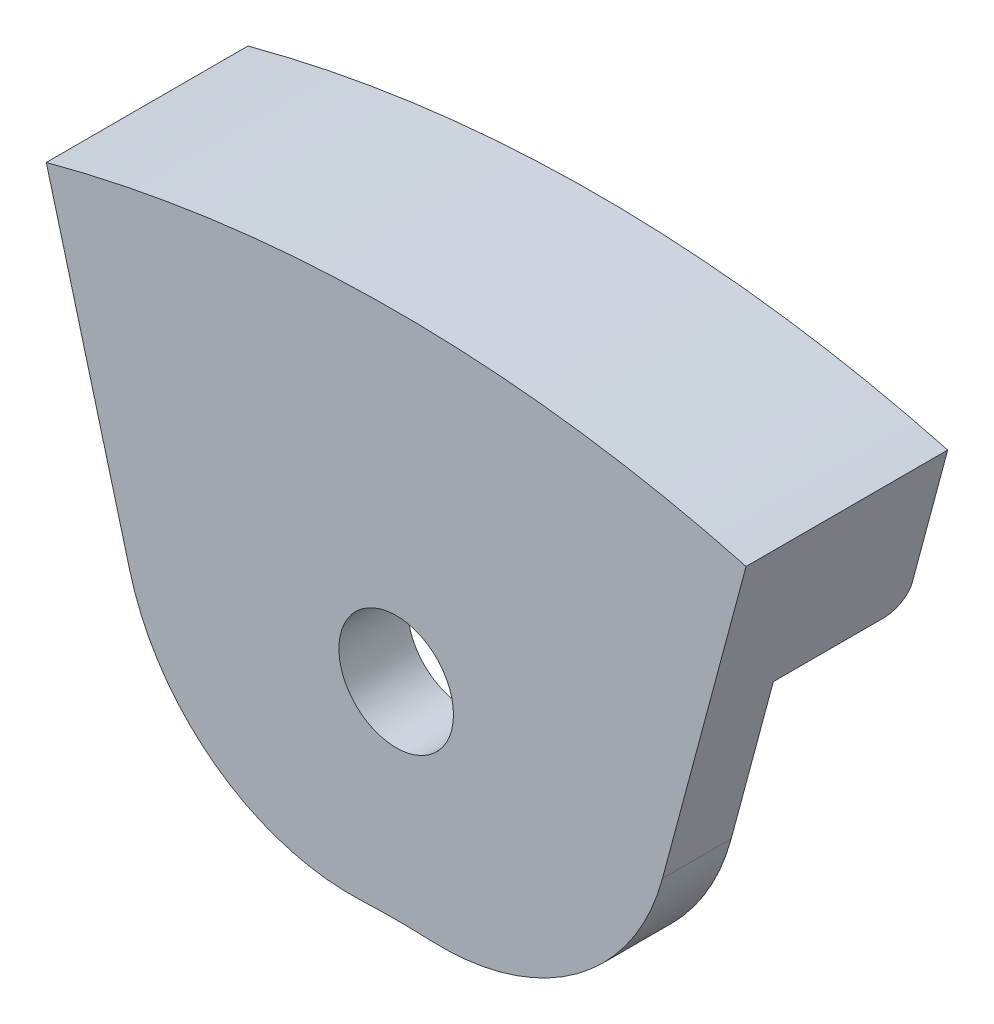
ISO-10303-21;
HEADER;
FILE_DESCRIPTION(('STEP AP214'),'2;1');
FILE_NAME('part.step','',(''),(''),'','','');
FILE_SCHEMA(('AUTOMOTIVE_DESIGN { 1 0 10303 214 1 1 1 1 }'));
ENDSEC;
DATA;
#1=APPLICATION_CONTEXT('core data for automotive mechanical design processes');
#2=APPLICATION_PROTOCOL_DEFINITION('international standard','automotive_design',2000,#1);
#3=PRODUCT_CONTEXT('',#1,'mechanical');
#4=PRODUCT('Part','Part','',(#3));
#5=PRODUCT_RELATED_PRODUCT_CATEGORY('part','',(#4));
#6=PRODUCT_DEFINITION_FORMATION('','',#4);
#7=PRODUCT_DEFINITION_CONTEXT('part definition',#1,'design');
#8=PRODUCT_DEFINITION('design','',#6,#7);
#9=PRODUCT_DEFINITION_SHAPE('','',#8);
#10=(LENGTH_UNIT() NAMED_UNIT(*) SI_UNIT(.MILLI.,.METRE.));
#11=(NAMED_UNIT(*) PLANE_ANGLE_UNIT() SI_UNIT($,.RADIAN.));
#12=(NAMED_UNIT(*) SI_UNIT($,.STERADIAN.) SOLID_ANGLE_UNIT());
#13=UNCERTAINTY_MEASURE_WITH_UNIT(LENGTH_MEASURE(1.E-05),#10,'distance_accuracy_value','');
#14=(GEOMETRIC_REPRESENTATION_CONTEXT(3) GLOBAL_UNCERTAINTY_ASSIGNED_CONTEXT((#13)) GLOBAL_UNIT_ASSIGNED_CONTEXT((#10,
#11,#12)) REPRESENTATION_CONTEXT('',''));
#15=CARTESIAN_POINT('',(0.,0.,0.));
#16=DIRECTION('',(0.,0.,1.));
#17=DIRECTION('',(1.,0.,0.));
#18=AXIS2_PLACEMENT_3D('',#15,#16,#17);
#19=CARTESIAN_POINT('',(0.,0.,2.9));
#20=DIRECTION('',(0.,0.,-1.));
#21=DIRECTION('',(-1.,0.,0.));
#22=AXIS2_PLACEMENT_3D('',#19,#20,#21);
#23=CYLINDRICAL_SURFACE('',#22,29.5);
#24=CARTESIAN_POINT('',(0.,0.,0.));
#25=DIRECTION('',(0.,0.,1.));
#26=DIRECTION('',(-1.,0.,0.));
#27=AXIS2_PLACEMENT_3D('',#24,#25,#26);
#28=CIRCLE('',#27,29.5);
#29=CARTESIAN_POINT('',(7.63516183052427,28.4948118755275,0.));
#30=VERTEX_POINT('',#29);
#31=CARTESIAN_POINT('',(-7.63516183052427,28.4948118755275,0.));
#32=VERTEX_POINT('',#31);
#33=EDGE_CURVE('E121',#30,#32,#28,.T.);
#34=ORIENTED_EDGE('',*,*,#33,.T.);
#35=DIRECTION('',(0.,0.,-1.));
#36=VECTOR('',#35,1.);
#37=CARTESIAN_POINT('',(-7.63516183052427,28.4948118755275,2.9));
#38=LINE('',#37,#36);
#39=CARTESIAN_POINT('',(-7.63516183052427,28.4948118755275,4.4));
#40=VERTEX_POINT('',#39);
#41=EDGE_CURVE('E115',#40,#32,#38,.T.);
#42=ORIENTED_EDGE('',*,*,#41,.F.);
#43=CARTESIAN_POINT('',(0.,0.,4.4));
#44=DIRECTION('',(0.,0.,1.));
#45=DIRECTION('',(1.,0.,0.));
#46=AXIS2_PLACEMENT_3D('',#43,#44,#45);
#47=CIRCLE('',#46,29.5);
#48=CARTESIAN_POINT('',(7.63516183052427,28.4948118755275,4.4));
#49=VERTEX_POINT('',#48);
#50=EDGE_CURVE('E119',#49,#40,#47,.T.);
#51=ORIENTED_EDGE('',*,*,#50,.F.);
#52=DIRECTION('',(0.,0.,-1.));
#53=VECTOR('',#52,1.);
#54=CARTESIAN_POINT('',(7.63516183052427,28.4948118755275,2.9));
#55=LINE('',#54,#53);
#56=EDGE_CURVE('E160',#49,#30,#55,.T.);
#57=ORIENTED_EDGE('',*,*,#56,.T.);
#58=EDGE_LOOP('',(#34,#42,#51,#57));
#59=FACE_BOUND('',#58,.T.);
#60=ADVANCED_FACE('F45',(#59),#23,.T.);
#61=CARTESIAN_POINT('',(-7.63516183052427,28.4948118755275,2.9));
#62=DIRECTION('',(0.965925826289069,0.258819045102518,0.));
#63=DIRECTION('',(-0.258819045102518,0.965925826289069,0.));
#64=AXIS2_PLACEMENT_3D('',#61,#62,#63);
#65=PLANE('',#64);
#66=DIRECTION('',(0.258819045102518,-0.965925826289069,0.));
#67=VECTOR('',#66,1.);
#68=CARTESIAN_POINT('',(-7.63516183052427,28.4948118755275,0.));
#69=LINE('',#68,#67);
#70=CARTESIAN_POINT('',(-6.85870469521672,25.5970343966603,0.));
#71=VERTEX_POINT('',#70);
#72=EDGE_CURVE('E163',#32,#71,#69,.T.);
#73=ORIENTED_EDGE('',*,*,#72,.T.);
#74=CARTESIAN_POINT('',(-6.85870469521672,25.5970343966603,0.5));
#75=DIRECTION('',(0.965925826289069,0.258819045102518,0.));
#76=DIRECTION('',(-0.258819045102518,0.965925826289069,0.));
#77=AXIS2_PLACEMENT_3D('',#74,#75,#76);
#78=CIRCLE('',#77,0.5);
#79=CARTESIAN_POINT('',(-6.72929517266546,25.1140714835158,0.5));
#80=VERTEX_POINT('',#79);
#81=EDGE_CURVE('E11',#71,#80,#78,.F.);
#82=ORIENTED_EDGE('',*,*,#81,.T.);
#83=DIRECTION('',(0.,0.,-1.));
#84=VECTOR('',#83,1.);
#85=CARTESIAN_POINT('',(-6.72929517266546,25.1140714835158,2.9));
#86=LINE('',#85,#84);
#87=CARTESIAN_POINT('',(-6.72929517266546,25.1140714835158,2.9));
#88=VERTEX_POINT('',#87);
#89=EDGE_CURVE('E124',#88,#80,#86,.T.);
#90=ORIENTED_EDGE('',*,*,#89,.F.);
#91=DIRECTION('',(0.258819045102518,-0.965925826289069,0.));
#92=VECTOR('',#91,1.);
#93=CARTESIAN_POINT('',(-7.63516183052427,28.4948118755275,2.9));
#94=LINE('',#93,#92);
#95=CARTESIAN_POINT('',(-5.81047315167368,21.6849810180613,2.9));
#96=VERTEX_POINT('',#95);
#97=EDGE_CURVE('E152',#88,#96,#94,.T.);
#98=ORIENTED_EDGE('',*,*,#97,.T.);
#99=DIRECTION('',(0.,0.,-1.));
#100=VECTOR('',#99,1.);
#101=CARTESIAN_POINT('',(-5.81047315167368,21.6849810180613,2.9));
#102=LINE('',#101,#100);
#103=CARTESIAN_POINT('',(-5.81047315167368,21.6849810180613,4.4));
#104=VERTEX_POINT('',#103);
#105=EDGE_CURVE('E131',#96,#104,#102,.F.);
#106=ORIENTED_EDGE('',*,*,#105,.T.);
#107=DIRECTION('',(0.258819045102518,-0.965925826289069,0.));
#108=VECTOR('',#107,1.);
#109=CARTESIAN_POINT('',(-7.63516183052427,28.4948118755275,4.4));
#110=LINE('',#109,#108);
#111=EDGE_CURVE('E127',#40,#104,#110,.T.);
#112=ORIENTED_EDGE('',*,*,#111,.F.);
#113=ORIENTED_EDGE('',*,*,#41,.T.);
#114=EDGE_LOOP('',(#73,#82,#90,#98,#106,#112,#113));
#115=FACE_BOUND('',#114,.T.);
#116=ADVANCED_FACE('F128',(#115),#65,.F.);
#117=CARTESIAN_POINT('',(0.,0.,2.9));
#118=DIRECTION('',(0.,0.,-1.));
#119=DIRECTION('',(-1.,0.,0.));
#120=AXIS2_PLACEMENT_3D('',#117,#118,#119);
#121=CYLINDRICAL_SURFACE('',#120,26.);
#122=ORIENTED_EDGE('',*,*,#89,.T.);
#123=CARTESIAN_POINT('',(0.,0.,0.5));
#124=DIRECTION('',(0.,0.,-1.));
#125=DIRECTION('',(-1.,0.,0.));
#126=AXIS2_PLACEMENT_3D('',#123,#124,#125);
#127=CIRCLE('',#126,26.);
#128=CARTESIAN_POINT('',(6.72929517266546,25.1140714835158,0.5));
#129=VERTEX_POINT('',#128);
#130=EDGE_CURVE('E187',#80,#129,#127,.T.);
#131=ORIENTED_EDGE('',*,*,#130,.T.);
#132=DIRECTION('',(0.,0.,-1.));
#133=VECTOR('',#132,1.);
#134=CARTESIAN_POINT('',(6.72929517266546,25.1140714835158,2.9));
#135=LINE('',#134,#133);
#136=CARTESIAN_POINT('',(6.72929517266546,25.1140714835158,2.9));
#137=VERTEX_POINT('',#136);
#138=EDGE_CURVE('E167',#137,#129,#135,.T.);
#139=ORIENTED_EDGE('',*,*,#138,.F.);
#140=CARTESIAN_POINT('',(0.,0.,2.9));
#141=DIRECTION('',(0.,0.,-1.));
#142=DIRECTION('',(-1.,0.,0.));
#143=AXIS2_PLACEMENT_3D('',#140,#141,#142);
#144=CIRCLE('',#143,26.);
#145=EDGE_CURVE('E157',#88,#137,#144,.T.);
#146=ORIENTED_EDGE('',*,*,#145,.F.);
#147=EDGE_LOOP('',(#122,#131,#139,#146));
#148=FACE_BOUND('',#147,.T.);
#149=ADVANCED_FACE('F193',(#148),#121,.F.);
#150=CARTESIAN_POINT('',(6.72929517266546,25.1140714835158,2.9));
#151=DIRECTION('',(-0.965925826289069,0.258819045102518,0.));
#152=DIRECTION('',(-0.258819045102518,-0.965925826289069,0.));
#153=AXIS2_PLACEMENT_3D('',#150,#151,#152);
#154=PLANE('',#153);
#155=ORIENTED_EDGE('',*,*,#138,.T.);
#156=CARTESIAN_POINT('',(6.85870469521672,25.5970343966603,0.5));
#157=DIRECTION('',(-0.965925826289069,0.258819045102518,0.));
#158=DIRECTION('',(-0.258819045102518,-0.965925826289069,0.));
#159=AXIS2_PLACEMENT_3D('',#156,#157,#158);
#160=CIRCLE('',#159,0.5);
#161=CARTESIAN_POINT('',(6.85870469521672,25.5970343966603,0.));
#162=VERTEX_POINT('',#161);
#163=EDGE_CURVE('E67',#129,#162,#160,.F.);
#164=ORIENTED_EDGE('',*,*,#163,.T.);
#165=DIRECTION('',(0.258819045102518,0.965925826289069,0.));
#166=VECTOR('',#165,1.);
#167=CARTESIAN_POINT('',(6.72929517266546,25.1140714835158,0.));
#168=LINE('',#167,#166);
#169=EDGE_CURVE('E161',#162,#30,#168,.T.);
#170=ORIENTED_EDGE('',*,*,#169,.T.);
#171=ORIENTED_EDGE('',*,*,#56,.F.);
#172=DIRECTION('',(0.258819045102518,0.965925826289069,0.));
#173=VECTOR('',#172,1.);
#174=CARTESIAN_POINT('',(4.65874281184532,17.3866648732032,4.4));
#175=LINE('',#174,#173);
#176=CARTESIAN_POINT('',(5.81047315167368,21.6849810180613,4.4));
#177=VERTEX_POINT('',#176);
#178=EDGE_CURVE('E140',#177,#49,#175,.T.);
#179=ORIENTED_EDGE('',*,*,#178,.F.);
#180=DIRECTION('',(0.,0.,-1.));
#181=VECTOR('',#180,1.);
#182=CARTESIAN_POINT('',(5.81047315167368,21.6849810180613,2.9));
#183=LINE('',#182,#181);
#184=CARTESIAN_POINT('',(5.81047315167368,21.6849810180613,2.9));
#185=VERTEX_POINT('',#184);
#186=EDGE_CURVE('E123',#177,#185,#183,.T.);
#187=ORIENTED_EDGE('',*,*,#186,.T.);
#188=DIRECTION('',(0.258819045102518,0.965925826289069,0.));
#189=VECTOR('',#188,1.);
#190=CARTESIAN_POINT('',(4.65874281184532,17.3866648732032,2.9));
#191=LINE('',#190,#189);
#192=EDGE_CURVE('E142',#185,#137,#191,.T.);
#193=ORIENTED_EDGE('',*,*,#192,.T.);
#194=EDGE_LOOP('',(#155,#164,#170,#171,#179,#187,#193));
#195=FACE_BOUND('',#194,.T.);
#196=ADVANCED_FACE('F197',(#195),#154,.F.);
#197=CARTESIAN_POINT('',(0.,0.,0.));
#198=DIRECTION('',(0.,0.,-1.));
#199=DIRECTION('',(-1.,0.,0.));
#200=AXIS2_PLACEMENT_3D('',#197,#198,#199);
#201=PLANE('',#200);
#202=ORIENTED_EDGE('',*,*,#169,.F.);
#203=CARTESIAN_POINT('',(0.,0.,0.));
#204=DIRECTION('',(0.,0.,-1.));
#205=DIRECTION('',(-1.,0.,0.));
#206=AXIS2_PLACEMENT_3D('',#203,#204,#205);
#207=CIRCLE('',#206,26.5);
#208=EDGE_CURVE('E53',#162,#71,#207,.F.);
#209=ORIENTED_EDGE('',*,*,#208,.T.);
#210=ORIENTED_EDGE('',*,*,#72,.F.);
#211=ORIENTED_EDGE('',*,*,#33,.F.);
#212=EDGE_LOOP('',(#202,#209,#210,#211));
#213=FACE_BOUND('',#212,.T.);
#214=ADVANCED_FACE('F214',(#213),#201,.T.);
#215=CARTESIAN_POINT('',(0.,0.,2.9));
#216=DIRECTION('',(0.,0.,1.));
#217=DIRECTION('',(1.,0.,0.));
#218=AXIS2_PLACEMENT_3D('',#215,#216,#217);
#219=PLANE('',#218);
#220=CARTESIAN_POINT('',(0.,22.5,2.9));
#221=DIRECTION('',(0.,0.,1.));
#222=DIRECTION('',(1.,0.,0.));
#223=AXIS2_PLACEMENT_3D('',#220,#221,#222);
#224=CIRCLE('',#223,1.25);
#225=CARTESIAN_POINT('',(1.25,22.5,2.9));
#226=VERTEX_POINT('',#225);
#227=EDGE_CURVE('E147',#226,#226,#224,.T.);
#228=ORIENTED_EDGE('',*,*,#227,.T.);
#229=EDGE_LOOP('',(#228));
#230=FACE_BOUND('',#229,.T.);
#231=ORIENTED_EDGE('',*,*,#192,.F.);
#232=CARTESIAN_POINT('',(0.980844020228334,22.9790762435739,2.9));
#233=DIRECTION('',(0.,0.,1.));
#234=DIRECTION('',(1.,0.,0.));
#235=AXIS2_PLACEMENT_3D('',#232,#233,#234);
#236=CIRCLE('',#235,5.);
#237=CARTESIAN_POINT('',(0.767617059309131,17.9836248862752,2.9));
#238=VERTEX_POINT('',#237);
#239=EDGE_CURVE('E175',#185,#238,#236,.F.);
#240=ORIENTED_EDGE('',*,*,#239,.T.);
#241=CARTESIAN_POINT('',(0.,0.,2.9));
#242=DIRECTION('',(0.,0.,-1.));
#243=DIRECTION('',(-1.,0.,0.));
#244=AXIS2_PLACEMENT_3D('',#241,#242,#243);
#245=CIRCLE('',#244,18.);
#246=CARTESIAN_POINT('',(-0.767617059309132,17.9836248862752,2.9));
#247=VERTEX_POINT('',#246);
#248=EDGE_CURVE('E144',#247,#238,#245,.T.);
#249=ORIENTED_EDGE('',*,*,#248,.F.);
#250=CARTESIAN_POINT('',(-0.980844020228335,22.9790762435739,2.9));
#251=DIRECTION('',(0.,0.,1.));
#252=DIRECTION('',(1.,0.,0.));
#253=AXIS2_PLACEMENT_3D('',#250,#251,#252);
#254=CIRCLE('',#253,5.);
#255=EDGE_CURVE('E173',#247,#96,#254,.F.);
#256=ORIENTED_EDGE('',*,*,#255,.T.);
#257=ORIENTED_EDGE('',*,*,#97,.F.);
#258=ORIENTED_EDGE('',*,*,#145,.T.);
#259=EDGE_LOOP('',(#231,#240,#249,#256,#257,#258));
#260=FACE_BOUND('',#259,.T.);
#261=ADVANCED_FACE('F201',(#230,#260),#219,.F.);
#262=CARTESIAN_POINT('',(0.,0.,4.4));
#263=DIRECTION('',(0.,0.,1.));
#264=DIRECTION('',(1.,0.,0.));
#265=AXIS2_PLACEMENT_3D('',#262,#263,#264);
#266=PLANE('',#265);
#267=CARTESIAN_POINT('',(0.,0.,4.4));
#268=DIRECTION('',(0.,0.,-1.));
#269=DIRECTION('',(-1.,0.,0.));
#270=AXIS2_PLACEMENT_3D('',#267,#268,#269);
#271=CIRCLE('',#270,18.);
#272=CARTESIAN_POINT('',(-0.767617059309132,17.9836248862752,4.4));
#273=VERTEX_POINT('',#272);
#274=CARTESIAN_POINT('',(0.767617059309131,17.9836248862752,4.4));
#275=VERTEX_POINT('',#274);
#276=EDGE_CURVE('E134',#273,#275,#271,.T.);
#277=ORIENTED_EDGE('',*,*,#276,.T.);
#278=CARTESIAN_POINT('',(0.980844020228334,22.9790762435739,4.4));
#279=DIRECTION('',(0.,0.,1.));
#280=DIRECTION('',(1.,0.,0.));
#281=AXIS2_PLACEMENT_3D('',#278,#279,#280);
#282=CIRCLE('',#281,5.);
#283=EDGE_CURVE('E184',#275,#177,#282,.T.);
#284=ORIENTED_EDGE('',*,*,#283,.T.);
#285=ORIENTED_EDGE('',*,*,#178,.T.);
#286=ORIENTED_EDGE('',*,*,#50,.T.);
#287=ORIENTED_EDGE('',*,*,#111,.T.);
#288=CARTESIAN_POINT('',(-0.980844020228335,22.9790762435739,4.4));
#289=DIRECTION('',(0.,0.,1.));
#290=DIRECTION('',(1.,0.,0.));
#291=AXIS2_PLACEMENT_3D('',#288,#289,#290);
#292=CIRCLE('',#291,5.);
#293=EDGE_CURVE('E182',#104,#273,#292,.T.);
#294=ORIENTED_EDGE('',*,*,#293,.T.);
#295=EDGE_LOOP('',(#277,#284,#285,#286,#287,#294));
#296=FACE_BOUND('',#295,.T.);
#297=CARTESIAN_POINT('',(0.,22.5,4.4));
#298=DIRECTION('',(0.,0.,1.));
#299=DIRECTION('',(1.,0.,0.));
#300=AXIS2_PLACEMENT_3D('',#297,#298,#299);
#301=CIRCLE('',#300,1.25);
#302=CARTESIAN_POINT('',(1.25,22.5,4.4));
#303=VERTEX_POINT('',#302);
#304=EDGE_CURVE('E154',#303,#303,#301,.T.);
#305=ORIENTED_EDGE('',*,*,#304,.F.);
#306=EDGE_LOOP('',(#305));
#307=FACE_BOUND('',#306,.T.);
#308=ADVANCED_FACE('F137',(#296,#307),#266,.T.);
#309=CARTESIAN_POINT('',(0.,0.,4.4));
#310=DIRECTION('',(0.,0.,-1.));
#311=DIRECTION('',(-1.,0.,0.));
#312=AXIS2_PLACEMENT_3D('',#309,#310,#311);
#313=CYLINDRICAL_SURFACE('',#312,18.);
#314=ORIENTED_EDGE('',*,*,#248,.T.);
#315=DIRECTION('',(0.,0.,-1.));
#316=VECTOR('',#315,1.);
#317=CARTESIAN_POINT('',(0.767617059309131,17.9836248862752,4.4));
#318=LINE('',#317,#316);
#319=EDGE_CURVE('E180',#238,#275,#318,.F.);
#320=ORIENTED_EDGE('',*,*,#319,.T.);
#321=ORIENTED_EDGE('',*,*,#276,.F.);
#322=DIRECTION('',(0.,0.,-1.));
#323=VECTOR('',#322,1.);
#324=CARTESIAN_POINT('',(-0.767617059309132,17.9836248862752,4.4));
#325=LINE('',#324,#323);
#326=EDGE_CURVE('E177',#273,#247,#325,.T.);
#327=ORIENTED_EDGE('',*,*,#326,.T.);
#328=EDGE_LOOP('',(#314,#320,#321,#327));
#329=FACE_BOUND('',#328,.T.);
#330=ADVANCED_FACE('F210',(#329),#313,.F.);
#331=CARTESIAN_POINT('',(0.,22.5,4.4));
#332=DIRECTION('',(0.,0.,-1.));
#333=DIRECTION('',(-1.,0.,0.));
#334=AXIS2_PLACEMENT_3D('',#331,#332,#333);
#335=CYLINDRICAL_SURFACE('',#334,1.25);
#336=ORIENTED_EDGE('',*,*,#304,.T.);
#337=EDGE_LOOP('',(#336));
#338=FACE_BOUND('',#337,.T.);
#339=ORIENTED_EDGE('',*,*,#227,.F.);
#340=EDGE_LOOP('',(#339));
#341=FACE_BOUND('',#340,.T.);
#342=ADVANCED_FACE('F230',(#338,#341),#335,.F.);
#343=CARTESIAN_POINT('',(0.980844020228334,22.9790762435739,4.4));
#344=DIRECTION('',(0.,0.,-1.));
#345=DIRECTION('',(-1.,0.,0.));
#346=AXIS2_PLACEMENT_3D('',#343,#344,#345);
#347=CYLINDRICAL_SURFACE('',#346,5.);
#348=ORIENTED_EDGE('',*,*,#283,.F.);
#349=ORIENTED_EDGE('',*,*,#319,.F.);
#350=ORIENTED_EDGE('',*,*,#239,.F.);
#351=ORIENTED_EDGE('',*,*,#186,.F.);
#352=EDGE_LOOP('',(#348,#349,#350,#351));
#353=FACE_BOUND('',#352,.T.);
#354=ADVANCED_FACE('F213',(#353),#347,.T.);
#355=CARTESIAN_POINT('',(-0.980844020228335,22.9790762435739,4.4));
#356=DIRECTION('',(0.,0.,-1.));
#357=DIRECTION('',(-1.,0.,0.));
#358=AXIS2_PLACEMENT_3D('',#355,#356,#357);
#359=CYLINDRICAL_SURFACE('',#358,5.);
#360=ORIENTED_EDGE('',*,*,#293,.F.);
#361=ORIENTED_EDGE('',*,*,#105,.F.);
#362=ORIENTED_EDGE('',*,*,#255,.F.);
#363=ORIENTED_EDGE('',*,*,#326,.F.);
#364=EDGE_LOOP('',(#360,#361,#362,#363));
#365=FACE_BOUND('',#364,.T.);
#366=ADVANCED_FACE('F205',(#365),#359,.T.);
#367=CARTESIAN_POINT('',(0.,0.,0.5));
#368=DIRECTION('',(0.,0.,-1.));
#369=DIRECTION('',(-1.,0.,0.));
#370=AXIS2_PLACEMENT_3D('',#367,#368,#369);
#371=TOROIDAL_SURFACE('',#370,26.5,0.5);
#372=ORIENTED_EDGE('',*,*,#81,.F.);
#373=ORIENTED_EDGE('',*,*,#208,.F.);
#374=ORIENTED_EDGE('',*,*,#163,.F.);
#375=ORIENTED_EDGE('',*,*,#130,.F.);
#376=EDGE_LOOP('',(#372,#373,#374,#375));
#377=FACE_BOUND('',#376,.T.);
#378=ADVANCED_FACE('F47',(#377),#371,.T.);
#379=CLOSED_SHELL('',(#60,#116,#149,#196,#214,#261,#308,#330,#342,#354,#366,#378));
#380=MANIFOLD_SOLID_BREP('B2',#379);
#381=ADVANCED_BREP_SHAPE_REPRESENTATION('',(#18,#380),#14);
#382=SHAPE_DEFINITION_REPRESENTATION(#9,#381);
ENDSEC;
END-ISO-10303-21;
